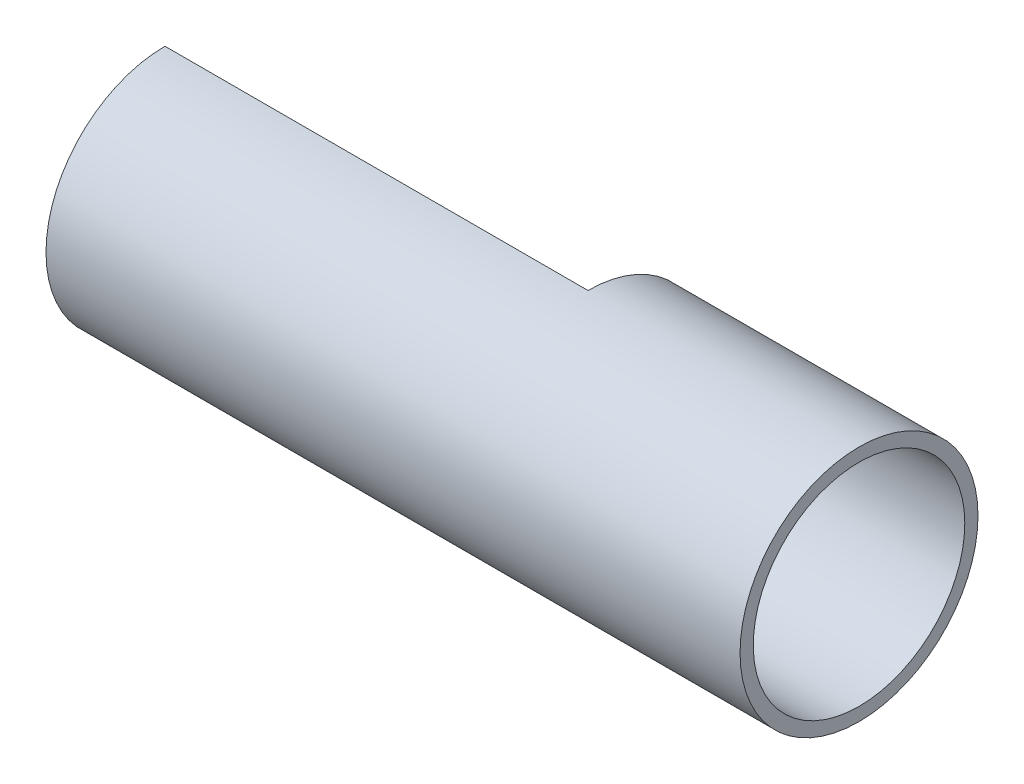
ISO-10303-21;
HEADER;
FILE_DESCRIPTION(('STEP AP214'),'2;1');
FILE_NAME('part.step','',(''),(''),'','','');
FILE_SCHEMA(('AUTOMOTIVE_DESIGN { 1 0 10303 214 1 1 1 1 }'));
ENDSEC;
DATA;
#1=APPLICATION_CONTEXT('core data for automotive mechanical design processes');
#2=APPLICATION_PROTOCOL_DEFINITION('international standard','automotive_design',2000,#1);
#3=PRODUCT_CONTEXT('',#1,'mechanical');
#4=PRODUCT('Part','Part','',(#3));
#5=PRODUCT_RELATED_PRODUCT_CATEGORY('part','',(#4));
#6=PRODUCT_DEFINITION_FORMATION('','',#4);
#7=PRODUCT_DEFINITION_CONTEXT('part definition',#1,'design');
#8=PRODUCT_DEFINITION('design','',#6,#7);
#9=PRODUCT_DEFINITION_SHAPE('','',#8);
#10=(LENGTH_UNIT() NAMED_UNIT(*) SI_UNIT(.MILLI.,.METRE.));
#11=(NAMED_UNIT(*) PLANE_ANGLE_UNIT() SI_UNIT($,.RADIAN.));
#12=(NAMED_UNIT(*) SI_UNIT($,.STERADIAN.) SOLID_ANGLE_UNIT());
#13=UNCERTAINTY_MEASURE_WITH_UNIT(LENGTH_MEASURE(1.E-05),#10,'distance_accuracy_value','');
#14=(GEOMETRIC_REPRESENTATION_CONTEXT(3) GLOBAL_UNCERTAINTY_ASSIGNED_CONTEXT((#13)) GLOBAL_UNIT_ASSIGNED_CONTEXT((#10,
#11,#12)) REPRESENTATION_CONTEXT('',''));
#15=CARTESIAN_POINT('',(0.,0.,0.));
#16=DIRECTION('',(0.,0.,1.));
#17=DIRECTION('',(1.,0.,0.));
#18=AXIS2_PLACEMENT_3D('',#15,#16,#17);
#19=CARTESIAN_POINT('',(9.3345,0.,0.));
#20=DIRECTION('',(-1.,0.,0.));
#21=DIRECTION('',(0.,0.,1.));
#22=AXIS2_PLACEMENT_3D('',#19,#20,#21);
#23=PLANE('',#22);
#24=CARTESIAN_POINT('',(9.3345,0.,0.));
#25=DIRECTION('',(-1.,0.,0.));
#26=DIRECTION('',(0.,0.,1.));
#27=AXIS2_PLACEMENT_3D('',#24,#25,#26);
#28=CIRCLE('',#27,1.27);
#29=CARTESIAN_POINT('',(9.3345,0.,1.27));
#30=VERTEX_POINT('',#29);
#31=EDGE_CURVE('E259',#30,#30,#28,.T.);
#32=ORIENTED_EDGE('',*,*,#31,.F.);
#33=EDGE_LOOP('',(#32));
#34=FACE_BOUND('',#33,.T.);
#35=DIRECTION('',(0.,0.989743318610787,0.142857142857142));
#36=VECTOR('',#35,1.);
#37=CARTESIAN_POINT('',(9.3345,8.7988181024499,1.27));
#38=LINE('',#37,#36);
#39=CARTESIAN_POINT('',(9.3345,8.7988181024499,1.27));
#40=VERTEX_POINT('',#39);
#41=CARTESIAN_POINT('',(9.3345,10.0557921170856,1.45142857142857));
#42=VERTEX_POINT('',#41);
#43=EDGE_CURVE('E184',#40,#42,#38,.T.);
#44=ORIENTED_EDGE('',*,*,#43,.T.);
#45=CARTESIAN_POINT('',(9.3345,0.,0.));
#46=DIRECTION('',(-1.,0.,0.));
#47=DIRECTION('',(0.,0.,1.));
#48=AXIS2_PLACEMENT_3D('',#45,#46,#47);
#49=CIRCLE('',#48,10.16);
#50=CARTESIAN_POINT('',(9.3345,10.0557921170856,-1.45142857142857));
#51=VERTEX_POINT('',#50);
#52=EDGE_CURVE('E240',#42,#51,#49,.T.);
#53=ORIENTED_EDGE('',*,*,#52,.T.);
#54=DIRECTION('',(0.,-0.989743318610787,0.142857142857144));
#55=VECTOR('',#54,1.);
#56=CARTESIAN_POINT('',(9.3345,8.7988181024499,-1.27));
#57=LINE('',#56,#55);
#58=CARTESIAN_POINT('',(9.3345,8.7988181024499,-1.27));
#59=VERTEX_POINT('',#58);
#60=EDGE_CURVE('E224',#51,#59,#57,.T.);
#61=ORIENTED_EDGE('',*,*,#60,.T.);
#62=CARTESIAN_POINT('',(9.3345,0.,0.));
#63=DIRECTION('',(-1.,0.,0.));
#64=DIRECTION('',(0.,0.,1.));
#65=AXIS2_PLACEMENT_3D('',#62,#63,#64);
#66=CIRCLE('',#65,8.89);
#67=CARTESIAN_POINT('',(9.3345,-8.7988181024499,-1.27));
#68=VERTEX_POINT('',#67);
#69=EDGE_CURVE('E220',#59,#68,#66,.T.);
#70=ORIENTED_EDGE('',*,*,#69,.T.);
#71=DIRECTION('',(0.,-0.989743318610788,-0.14285714285714));
#72=VECTOR('',#71,1.);
#73=CARTESIAN_POINT('',(9.3345,-8.7988181024499,-1.27));
#74=LINE('',#73,#72);
#75=CARTESIAN_POINT('',(9.3345,-10.0557921170856,-1.45142857142857));
#76=VERTEX_POINT('',#75);
#77=EDGE_CURVE('E212',#68,#76,#74,.T.);
#78=ORIENTED_EDGE('',*,*,#77,.T.);
#79=CARTESIAN_POINT('',(9.3345,-10.0557921170856,1.45142857142857));
#80=VERTEX_POINT('',#79);
#81=EDGE_CURVE('E244',#76,#80,#49,.T.);
#82=ORIENTED_EDGE('',*,*,#81,.T.);
#83=DIRECTION('',(0.,0.989743318610787,-0.142857142857143));
#84=VECTOR('',#83,1.);
#85=CARTESIAN_POINT('',(9.3345,-10.0557921170856,1.45142857142857));
#86=LINE('',#85,#84);
#87=CARTESIAN_POINT('',(9.3345,-8.7988181024499,1.27));
#88=VERTEX_POINT('',#87);
#89=EDGE_CURVE('E199',#80,#88,#86,.T.);
#90=ORIENTED_EDGE('',*,*,#89,.T.);
#91=CARTESIAN_POINT('',(9.3345,0.,0.));
#92=DIRECTION('',(-1.,0.,0.));
#93=DIRECTION('',(0.,0.,1.));
#94=AXIS2_PLACEMENT_3D('',#91,#92,#93);
#95=CIRCLE('',#94,8.89);
#96=EDGE_CURVE('E194',#88,#40,#95,.T.);
#97=ORIENTED_EDGE('',*,*,#96,.T.);
#98=EDGE_LOOP('',(#44,#53,#61,#70,#78,#82,#90,#97));
#99=FACE_BOUND('',#98,.T.);
#100=ADVANCED_FACE('F39',(#34,#99),#23,.T.);
#101=CARTESIAN_POINT('',(10.6045,0.,0.));
#102=DIRECTION('',(-1.,0.,0.));
#103=DIRECTION('',(0.,0.,1.));
#104=AXIS2_PLACEMENT_3D('',#101,#102,#103);
#105=PLANE('',#104);
#106=CARTESIAN_POINT('',(10.6045,0.,0.));
#107=DIRECTION('',(-1.,0.,0.));
#108=DIRECTION('',(0.,0.,1.));
#109=AXIS2_PLACEMENT_3D('',#106,#107,#108);
#110=CIRCLE('',#109,1.27);
#111=CARTESIAN_POINT('',(10.6045,0.,1.27));
#112=VERTEX_POINT('',#111);
#113=EDGE_CURVE('E239',#112,#112,#110,.T.);
#114=ORIENTED_EDGE('',*,*,#113,.T.);
#115=EDGE_LOOP('',(#114));
#116=FACE_BOUND('',#115,.T.);
#117=CARTESIAN_POINT('',(10.6045,0.,0.));
#118=DIRECTION('',(-1.,0.,0.));
#119=DIRECTION('',(0.,0.,1.));
#120=AXIS2_PLACEMENT_3D('',#117,#118,#119);
#121=CIRCLE('',#120,10.16);
#122=CARTESIAN_POINT('',(10.6045,10.0557921170856,-1.45142857142857));
#123=VERTEX_POINT('',#122);
#124=CARTESIAN_POINT('',(10.6045,10.0557921170856,1.45142857142857));
#125=VERTEX_POINT('',#124);
#126=EDGE_CURVE('E235',#123,#125,#121,.F.);
#127=ORIENTED_EDGE('',*,*,#126,.T.);
#128=DIRECTION('',(0.,0.989743318610787,0.142857142857142));
#129=VECTOR('',#128,1.);
#130=CARTESIAN_POINT('',(10.6045,8.7988181024499,1.27));
#131=LINE('',#130,#129);
#132=CARTESIAN_POINT('',(10.6045,8.7988181024499,1.27));
#133=VERTEX_POINT('',#132);
#134=EDGE_CURVE('E185',#133,#125,#131,.T.);
#135=ORIENTED_EDGE('',*,*,#134,.F.);
#136=CARTESIAN_POINT('',(10.6045,0.,0.));
#137=DIRECTION('',(-1.,0.,0.));
#138=DIRECTION('',(0.,0.,-1.));
#139=AXIS2_PLACEMENT_3D('',#136,#137,#138);
#140=CIRCLE('',#139,8.89);
#141=CARTESIAN_POINT('',(10.6045,-8.7988181024499,1.27));
#142=VERTEX_POINT('',#141);
#143=EDGE_CURVE('E187',#142,#133,#140,.T.);
#144=ORIENTED_EDGE('',*,*,#143,.F.);
#145=DIRECTION('',(0.,0.989743318610787,-0.142857142857143));
#146=VECTOR('',#145,1.);
#147=CARTESIAN_POINT('',(10.6045,-10.0557921170856,1.45142857142857));
#148=LINE('',#147,#146);
#149=CARTESIAN_POINT('',(10.6045,-10.0557921170856,1.45142857142857));
#150=VERTEX_POINT('',#149);
#151=EDGE_CURVE('E181',#150,#142,#148,.T.);
#152=ORIENTED_EDGE('',*,*,#151,.F.);
#153=CARTESIAN_POINT('',(10.6045,-10.0557921170856,-1.45142857142856));
#154=VERTEX_POINT('',#153);
#155=EDGE_CURVE('E236',#150,#154,#121,.F.);
#156=ORIENTED_EDGE('',*,*,#155,.T.);
#157=DIRECTION('',(0.,-0.989743318610787,-0.14285714285714));
#158=VECTOR('',#157,1.);
#159=CARTESIAN_POINT('',(10.6045,-8.7988181024499,-1.27));
#160=LINE('',#159,#158);
#161=CARTESIAN_POINT('',(10.6045,-8.7988181024499,-1.27));
#162=VERTEX_POINT('',#161);
#163=EDGE_CURVE('E213',#162,#154,#160,.T.);
#164=ORIENTED_EDGE('',*,*,#163,.F.);
#165=CARTESIAN_POINT('',(10.6045,0.,0.));
#166=DIRECTION('',(-1.,0.,0.));
#167=DIRECTION('',(0.,0.,1.));
#168=AXIS2_PLACEMENT_3D('',#165,#166,#167);
#169=CIRCLE('',#168,8.89);
#170=CARTESIAN_POINT('',(10.6045,8.7988181024499,-1.27));
#171=VERTEX_POINT('',#170);
#172=EDGE_CURVE('E180',#171,#162,#169,.T.);
#173=ORIENTED_EDGE('',*,*,#172,.F.);
#174=DIRECTION('',(0.,-0.989743318610787,0.142857142857144));
#175=VECTOR('',#174,1.);
#176=CARTESIAN_POINT('',(10.6045,8.7988181024499,-1.27));
#177=LINE('',#176,#175);
#178=EDGE_CURVE('E209',#123,#171,#177,.T.);
#179=ORIENTED_EDGE('',*,*,#178,.F.);
#180=EDGE_LOOP('',(#127,#135,#144,#152,#156,#164,#173,#179));
#181=FACE_BOUND('',#180,.T.);
#182=ADVANCED_FACE('F309',(#116,#181),#105,.F.);
#183=CARTESIAN_POINT('',(-39.6875,0.,0.));
#184=DIRECTION('',(1.,0.,0.));
#185=DIRECTION('',(0.,0.,-1.));
#186=AXIS2_PLACEMENT_3D('',#183,#184,#185);
#187=CYLINDRICAL_SURFACE('',#186,1.27);
#188=ORIENTED_EDGE('',*,*,#113,.F.);
#189=EDGE_LOOP('',(#188));
#190=FACE_BOUND('',#189,.T.);
#191=ORIENTED_EDGE('',*,*,#31,.T.);
#192=EDGE_LOOP('',(#191));
#193=FACE_BOUND('',#192,.T.);
#194=ADVANCED_FACE('F295',(#190,#193),#187,.F.);
#195=CARTESIAN_POINT('',(-33.3375,0.,0.));
#196=DIRECTION('',(1.,0.,0.));
#197=DIRECTION('',(0.,1.,0.));
#198=AXIS2_PLACEMENT_3D('',#195,#196,#197);
#199=SPHERICAL_SURFACE('',#198,6.35);
#200=CARTESIAN_POINT('',(-33.3375,0.,0.));
#201=DIRECTION('',(1.,0.,0.));
#202=DIRECTION('',(0.,0.,-1.));
#203=AXIS2_PLACEMENT_3D('',#200,#201,#202);
#204=CIRCLE('',#203,6.35);
#205=CARTESIAN_POINT('',(-33.3375,6.35,0.));
#206=VERTEX_POINT('',#205);
#207=CARTESIAN_POINT('',(-33.3375,-6.35,0.));
#208=VERTEX_POINT('',#207);
#209=EDGE_CURVE('E248',#206,#208,#204,.T.);
#210=ORIENTED_EDGE('',*,*,#209,.F.);
#211=CARTESIAN_POINT('',(-33.3375,0.,0.));
#212=DIRECTION('',(-1.,0.,0.));
#213=DIRECTION('',(0.,0.,1.));
#214=AXIS2_PLACEMENT_3D('',#211,#212,#213);
#215=CIRCLE('',#214,6.35);
#216=EDGE_CURVE('E155',#208,#206,#215,.F.);
#217=ORIENTED_EDGE('',*,*,#216,.F.);
#218=EDGE_LOOP('',(#210,#217));
#219=FACE_BOUND('',#218,.T.);
#220=CARTESIAN_POINT('',(-39.5592039466693,0.,0.));
#221=DIRECTION('',(1.,0.,0.));
#222=DIRECTION('',(0.,0.,-1.));
#223=AXIS2_PLACEMENT_3D('',#220,#221,#222);
#224=CIRCLE('',#223,1.27);
#225=CARTESIAN_POINT('',(-39.5592039466693,0.,-1.27));
#226=VERTEX_POINT('',#225);
#227=EDGE_CURVE('E251',#226,#226,#224,.T.);
#228=ORIENTED_EDGE('',*,*,#227,.T.);
#229=EDGE_LOOP('',(#228));
#230=FACE_BOUND('',#229,.T.);
#231=ADVANCED_FACE('F292',(#219,#230),#199,.T.);
#232=CARTESIAN_POINT('',(33.3375,0.,0.));
#233=DIRECTION('',(-1.,0.,0.));
#234=DIRECTION('',(0.,0.,1.));
#235=AXIS2_PLACEMENT_3D('',#232,#233,#234);
#236=CYLINDRICAL_SURFACE('',#235,11.43);
#237=CARTESIAN_POINT('',(33.3375,0.,0.));
#238=DIRECTION('',(1.,0.,0.));
#239=DIRECTION('',(0.,0.,-1.));
#240=AXIS2_PLACEMENT_3D('',#237,#238,#239);
#241=CIRCLE('',#240,11.43);
#242=CARTESIAN_POINT('',(33.3375,0.,-11.43));
#243=VERTEX_POINT('',#242);
#244=EDGE_CURVE('E252',#243,#243,#241,.T.);
#245=ORIENTED_EDGE('',*,*,#244,.F.);
#246=EDGE_LOOP('',(#245));
#247=FACE_BOUND('',#246,.T.);
#248=CARTESIAN_POINT('',(7.3025,0.,0.));
#249=DIRECTION('',(1.,0.,0.));
#250=DIRECTION('',(0.,0.,-1.));
#251=AXIS2_PLACEMENT_3D('',#248,#249,#250);
#252=CIRCLE('',#251,11.43);
#253=CARTESIAN_POINT('',(7.3025,-11.43,0.));
#254=VERTEX_POINT('',#253);
#255=CARTESIAN_POINT('',(7.3025,11.43,0.));
#256=VERTEX_POINT('',#255);
#257=EDGE_CURVE('E147',#254,#256,#252,.T.);
#258=ORIENTED_EDGE('',*,*,#257,.T.);
#259=DIRECTION('',(-1.,0.,0.));
#260=VECTOR('',#259,1.);
#261=CARTESIAN_POINT('',(-33.3375,11.43,0.));
#262=LINE('',#261,#260);
#263=CARTESIAN_POINT('',(-33.3375,11.43,0.));
#264=VERTEX_POINT('',#263);
#265=EDGE_CURVE('E161',#256,#264,#262,.T.);
#266=ORIENTED_EDGE('',*,*,#265,.T.);
#267=CARTESIAN_POINT('',(-33.3375,0.,0.));
#268=DIRECTION('',(1.,0.,0.));
#269=DIRECTION('',(0.,0.,-1.));
#270=AXIS2_PLACEMENT_3D('',#267,#268,#269);
#271=CIRCLE('',#270,11.43);
#272=CARTESIAN_POINT('',(-33.3375,-11.43,0.));
#273=VERTEX_POINT('',#272);
#274=EDGE_CURVE('E165',#264,#273,#271,.T.);
#275=ORIENTED_EDGE('',*,*,#274,.T.);
#276=DIRECTION('',(1.,0.,0.));
#277=VECTOR('',#276,1.);
#278=CARTESIAN_POINT('',(-33.3375,-11.43,0.));
#279=LINE('',#278,#277);
#280=EDGE_CURVE('E54',#273,#254,#279,.T.);
#281=ORIENTED_EDGE('',*,*,#280,.T.);
#282=EDGE_LOOP('',(#258,#266,#275,#281));
#283=FACE_BOUND('',#282,.T.);
#284=ADVANCED_FACE('F41',(#247,#283),#236,.T.);
#285=CARTESIAN_POINT('',(33.3375,0.,0.));
#286=DIRECTION('',(1.,0.,0.));
#287=DIRECTION('',(0.,0.,-1.));
#288=AXIS2_PLACEMENT_3D('',#285,#286,#287);
#289=PLANE('',#288);
#290=CARTESIAN_POINT('',(33.3375,0.,0.));
#291=DIRECTION('',(1.,0.,0.));
#292=DIRECTION('',(0.,0.,-1.));
#293=AXIS2_PLACEMENT_3D('',#290,#291,#292);
#294=CIRCLE('',#293,10.16);
#295=CARTESIAN_POINT('',(33.3375,0.,-10.16));
#296=VERTEX_POINT('',#295);
#297=EDGE_CURVE('E208',#296,#296,#294,.T.);
#298=ORIENTED_EDGE('',*,*,#297,.F.);
#299=EDGE_LOOP('',(#298));
#300=FACE_BOUND('',#299,.T.);
#301=ORIENTED_EDGE('',*,*,#244,.T.);
#302=EDGE_LOOP('',(#301));
#303=FACE_BOUND('',#302,.T.);
#304=ADVANCED_FACE('F307',(#300,#303),#289,.T.);
#305=CARTESIAN_POINT('',(-33.3375,0.,0.));
#306=DIRECTION('',(1.,0.,0.));
#307=DIRECTION('',(0.,0.,-1.));
#308=AXIS2_PLACEMENT_3D('',#305,#306,#307);
#309=PLANE('',#308);
#310=ORIENTED_EDGE('',*,*,#274,.F.);
#311=DIRECTION('',(0.,-1.,0.));
#312=VECTOR('',#311,1.);
#313=CARTESIAN_POINT('',(-33.3375,11.43,0.));
#314=LINE('',#313,#312);
#315=EDGE_CURVE('E166',#264,#206,#314,.T.);
#316=ORIENTED_EDGE('',*,*,#315,.T.);
#317=ORIENTED_EDGE('',*,*,#209,.T.);
#318=EDGE_CURVE('E171',#208,#273,#314,.T.);
#319=ORIENTED_EDGE('',*,*,#318,.T.);
#320=EDGE_LOOP('',(#310,#316,#317,#319));
#321=FACE_BOUND('',#320,.T.);
#322=ADVANCED_FACE('F289',(#321),#309,.F.);
#323=DIRECTION('',(1.,0.,0.));
#324=VECTOR('',#323,1.);
#325=CARTESIAN_POINT('',(-39.6875,-1.27,0.));
#326=LINE('',#325,#324);
#327=CARTESIAN_POINT('',(-33.3375,-1.27,0.));
#328=VERTEX_POINT('',#327);
#329=CARTESIAN_POINT('',(-30.7975,-1.27,0.));
#330=VERTEX_POINT('',#329);
#331=EDGE_CURVE('E156',#328,#330,#326,.T.);
#332=ORIENTED_EDGE('',*,*,#331,.F.);
#333=CARTESIAN_POINT('',(-33.3375,0.,0.));
#334=DIRECTION('',(-1.,0.,0.));
#335=DIRECTION('',(0.,0.,1.));
#336=AXIS2_PLACEMENT_3D('',#333,#334,#335);
#337=CIRCLE('',#336,1.27);
#338=CARTESIAN_POINT('',(-33.3375,1.27,0.));
#339=VERTEX_POINT('',#338);
#340=EDGE_CURVE('E12',#339,#328,#337,.T.);
#341=ORIENTED_EDGE('',*,*,#340,.F.);
#342=DIRECTION('',(1.,0.,0.));
#343=VECTOR('',#342,1.);
#344=CARTESIAN_POINT('',(-39.6875,1.27,0.));
#345=LINE('',#344,#343);
#346=CARTESIAN_POINT('',(-30.7975,1.27,0.));
#347=VERTEX_POINT('',#346);
#348=EDGE_CURVE('E175',#347,#339,#345,.F.);
#349=ORIENTED_EDGE('',*,*,#348,.F.);
#350=CARTESIAN_POINT('',(-30.7975,0.,0.));
#351=DIRECTION('',(-1.,0.,0.));
#352=DIRECTION('',(0.,0.,1.));
#353=AXIS2_PLACEMENT_3D('',#350,#351,#352);
#354=CIRCLE('',#353,1.27);
#355=EDGE_CURVE('E243',#330,#347,#354,.T.);
#356=ORIENTED_EDGE('',*,*,#355,.F.);
#357=EDGE_LOOP('',(#332,#341,#349,#356));
#358=FACE_BOUND('',#357,.T.);
#359=ORIENTED_EDGE('',*,*,#227,.F.);
#360=EDGE_LOOP('',(#359));
#361=FACE_BOUND('',#360,.T.);
#362=ADVANCED_FACE('F276',(#358,#361),#187,.F.);
#363=CARTESIAN_POINT('',(9.3345,0.,0.));
#364=DIRECTION('',(-1.,0.,0.));
#365=DIRECTION('',(0.,0.,1.));
#366=AXIS2_PLACEMENT_3D('',#363,#364,#365);
#367=CYLINDRICAL_SURFACE('',#366,10.16);
#368=DIRECTION('',(1.,0.,0.));
#369=VECTOR('',#368,1.);
#370=CARTESIAN_POINT('',(-12.654313528887,-10.0557921170856,1.45142857142857));
#371=LINE('',#370,#369);
#372=EDGE_CURVE('E202',#80,#150,#371,.T.);
#373=ORIENTED_EDGE('',*,*,#372,.F.);
#374=ORIENTED_EDGE('',*,*,#81,.F.);
#375=DIRECTION('',(1.,0.,0.));
#376=VECTOR('',#375,1.);
#377=CARTESIAN_POINT('',(-12.654313528887,-10.0557921170856,-1.45142857142857));
#378=LINE('',#377,#376);
#379=EDGE_CURVE('E219',#76,#154,#378,.T.);
#380=ORIENTED_EDGE('',*,*,#379,.T.);
#381=ORIENTED_EDGE('',*,*,#155,.F.);
#382=EDGE_LOOP('',(#373,#374,#380,#381));
#383=FACE_BOUND('',#382,.T.);
#384=ORIENTED_EDGE('',*,*,#52,.F.);
#385=DIRECTION('',(1.,0.,0.));
#386=VECTOR('',#385,1.);
#387=CARTESIAN_POINT('',(-12.654313528887,10.0557921170856,1.45142857142857));
#388=LINE('',#387,#386);
#389=EDGE_CURVE('E193',#42,#125,#388,.T.);
#390=ORIENTED_EDGE('',*,*,#389,.T.);
#391=ORIENTED_EDGE('',*,*,#126,.F.);
#392=DIRECTION('',(1.,0.,0.));
#393=VECTOR('',#392,1.);
#394=CARTESIAN_POINT('',(-12.654313528887,10.0557921170856,-1.45142857142857));
#395=LINE('',#394,#393);
#396=EDGE_CURVE('E227',#51,#123,#395,.T.);
#397=ORIENTED_EDGE('',*,*,#396,.F.);
#398=EDGE_LOOP('',(#384,#390,#391,#397));
#399=FACE_BOUND('',#398,.T.);
#400=CARTESIAN_POINT('',(-30.7975,0.,0.));
#401=DIRECTION('',(-1.,0.,0.));
#402=DIRECTION('',(0.,0.,1.));
#403=AXIS2_PLACEMENT_3D('',#400,#401,#402);
#404=CIRCLE('',#403,10.16);
#405=CARTESIAN_POINT('',(-30.7975,-10.16,0.));
#406=VERTEX_POINT('',#405);
#407=CARTESIAN_POINT('',(-30.7975,10.16,0.));
#408=VERTEX_POINT('',#407);
#409=EDGE_CURVE('E245',#406,#408,#404,.T.);
#410=ORIENTED_EDGE('',*,*,#409,.T.);
#411=DIRECTION('',(-1.,0.,0.));
#412=VECTOR('',#411,1.);
#413=CARTESIAN_POINT('',(9.3345,10.16,0.));
#414=LINE('',#413,#412);
#415=CARTESIAN_POINT('',(7.3025,10.16,0.));
#416=VERTEX_POINT('',#415);
#417=EDGE_CURVE('E62',#408,#416,#414,.F.);
#418=ORIENTED_EDGE('',*,*,#417,.T.);
#419=CARTESIAN_POINT('',(7.3025,0.,0.));
#420=DIRECTION('',(1.,0.,0.));
#421=DIRECTION('',(0.,0.,-1.));
#422=AXIS2_PLACEMENT_3D('',#419,#420,#421);
#423=CIRCLE('',#422,10.16);
#424=CARTESIAN_POINT('',(7.3025,-10.16,0.));
#425=VERTEX_POINT('',#424);
#426=EDGE_CURVE('E47',#416,#425,#423,.F.);
#427=ORIENTED_EDGE('',*,*,#426,.T.);
#428=DIRECTION('',(-1.,0.,0.));
#429=VECTOR('',#428,1.);
#430=CARTESIAN_POINT('',(9.3345,-10.16,0.));
#431=LINE('',#430,#429);
#432=EDGE_CURVE('E160',#425,#406,#431,.T.);
#433=ORIENTED_EDGE('',*,*,#432,.T.);
#434=EDGE_LOOP('',(#410,#418,#427,#433));
#435=FACE_BOUND('',#434,.T.);
#436=ORIENTED_EDGE('',*,*,#297,.T.);
#437=EDGE_LOOP('',(#436));
#438=FACE_BOUND('',#437,.T.);
#439=ADVANCED_FACE('F299',(#383,#399,#435,#438),#367,.F.);
#440=CARTESIAN_POINT('',(-30.7975,0.,0.));
#441=DIRECTION('',(-1.,0.,0.));
#442=DIRECTION('',(0.,0.,1.));
#443=AXIS2_PLACEMENT_3D('',#440,#441,#442);
#444=PLANE('',#443);
#445=ORIENTED_EDGE('',*,*,#409,.F.);
#446=DIRECTION('',(0.,1.,0.));
#447=VECTOR('',#446,1.);
#448=CARTESIAN_POINT('',(-30.7975,0.,0.));
#449=LINE('',#448,#447);
#450=EDGE_CURVE('E266',#406,#330,#449,.T.);
#451=ORIENTED_EDGE('',*,*,#450,.T.);
#452=ORIENTED_EDGE('',*,*,#355,.T.);
#453=EDGE_CURVE('E255',#347,#408,#449,.T.);
#454=ORIENTED_EDGE('',*,*,#453,.T.);
#455=EDGE_LOOP('',(#445,#451,#452,#454));
#456=FACE_BOUND('',#455,.T.);
#457=ADVANCED_FACE('F272',(#456),#444,.F.);
#458=CARTESIAN_POINT('',(-12.654313528887,-8.7988181024499,-1.27));
#459=DIRECTION('',(0.,-0.14285714285714,0.989743318610788));
#460=DIRECTION('',(0.,-0.989743318610788,-0.14285714285714));
#461=AXIS2_PLACEMENT_3D('',#458,#459,#460);
#462=PLANE('',#461);
#463=DIRECTION('',(1.,0.,0.));
#464=VECTOR('',#463,1.);
#465=CARTESIAN_POINT('',(-12.654313528887,-8.7988181024499,-1.27));
#466=LINE('',#465,#464);
#467=EDGE_CURVE('E190',#68,#162,#466,.T.);
#468=ORIENTED_EDGE('',*,*,#467,.T.);
#469=ORIENTED_EDGE('',*,*,#163,.T.);
#470=ORIENTED_EDGE('',*,*,#379,.F.);
#471=ORIENTED_EDGE('',*,*,#77,.F.);
#472=EDGE_LOOP('',(#468,#469,#470,#471));
#473=FACE_BOUND('',#472,.T.);
#474=ADVANCED_FACE('F324',(#473),#462,.F.);
#475=CARTESIAN_POINT('',(-12.654313528887,8.7988181024499,-1.27));
#476=DIRECTION('',(0.,0.142857142857144,0.989743318610787));
#477=DIRECTION('',(0.,-0.989743318610787,0.142857142857144));
#478=AXIS2_PLACEMENT_3D('',#475,#476,#477);
#479=PLANE('',#478);
#480=ORIENTED_EDGE('',*,*,#396,.T.);
#481=ORIENTED_EDGE('',*,*,#178,.T.);
#482=DIRECTION('',(1.,0.,0.));
#483=VECTOR('',#482,1.);
#484=CARTESIAN_POINT('',(-12.654313528887,8.7988181024499,-1.27));
#485=LINE('',#484,#483);
#486=EDGE_CURVE('E223',#59,#171,#485,.T.);
#487=ORIENTED_EDGE('',*,*,#486,.F.);
#488=ORIENTED_EDGE('',*,*,#60,.F.);
#489=EDGE_LOOP('',(#480,#481,#487,#488));
#490=FACE_BOUND('',#489,.T.);
#491=ADVANCED_FACE('F328',(#490),#479,.F.);
#492=CARTESIAN_POINT('',(-12.654313528887,0.,0.));
#493=DIRECTION('',(1.,0.,0.));
#494=DIRECTION('',(0.,0.,-1.));
#495=AXIS2_PLACEMENT_3D('',#492,#493,#494);
#496=CYLINDRICAL_SURFACE('',#495,8.89);
#497=ORIENTED_EDGE('',*,*,#486,.T.);
#498=ORIENTED_EDGE('',*,*,#172,.T.);
#499=ORIENTED_EDGE('',*,*,#467,.F.);
#500=ORIENTED_EDGE('',*,*,#69,.F.);
#501=EDGE_LOOP('',(#497,#498,#499,#500));
#502=FACE_BOUND('',#501,.T.);
#503=ADVANCED_FACE('F333',(#502),#496,.T.);
#504=CARTESIAN_POINT('',(-12.654313528887,8.7988181024499,1.27));
#505=DIRECTION('',(0.,0.142857142857142,-0.989743318610787));
#506=DIRECTION('',(0.,0.989743318610787,0.142857142857142));
#507=AXIS2_PLACEMENT_3D('',#504,#505,#506);
#508=PLANE('',#507);
#509=DIRECTION('',(1.,0.,0.));
#510=VECTOR('',#509,1.);
#511=CARTESIAN_POINT('',(-12.654313528887,8.7988181024499,1.27));
#512=LINE('',#511,#510);
#513=EDGE_CURVE('E197',#40,#133,#512,.T.);
#514=ORIENTED_EDGE('',*,*,#513,.T.);
#515=ORIENTED_EDGE('',*,*,#134,.T.);
#516=ORIENTED_EDGE('',*,*,#389,.F.);
#517=ORIENTED_EDGE('',*,*,#43,.F.);
#518=EDGE_LOOP('',(#514,#515,#516,#517));
#519=FACE_BOUND('',#518,.T.);
#520=ADVANCED_FACE('F339',(#519),#508,.F.);
#521=CARTESIAN_POINT('',(-12.654313528887,-10.0557921170856,1.45142857142857));
#522=DIRECTION('',(0.,-0.142857142857143,-0.989743318610787));
#523=DIRECTION('',(0.,0.989743318610787,-0.142857142857143));
#524=AXIS2_PLACEMENT_3D('',#521,#522,#523);
#525=PLANE('',#524);
#526=ORIENTED_EDGE('',*,*,#372,.T.);
#527=ORIENTED_EDGE('',*,*,#151,.T.);
#528=DIRECTION('',(1.,0.,0.));
#529=VECTOR('',#528,1.);
#530=CARTESIAN_POINT('',(-12.654313528887,-8.7988181024499,1.27));
#531=LINE('',#530,#529);
#532=EDGE_CURVE('E198',#88,#142,#531,.T.);
#533=ORIENTED_EDGE('',*,*,#532,.F.);
#534=ORIENTED_EDGE('',*,*,#89,.F.);
#535=EDGE_LOOP('',(#526,#527,#533,#534));
#536=FACE_BOUND('',#535,.T.);
#537=ADVANCED_FACE('F343',(#536),#525,.F.);
#538=CARTESIAN_POINT('',(-12.654313528887,0.,0.));
#539=DIRECTION('',(1.,0.,0.));
#540=DIRECTION('',(0.,0.,-1.));
#541=AXIS2_PLACEMENT_3D('',#538,#539,#540);
#542=CYLINDRICAL_SURFACE('',#541,8.89);
#543=ORIENTED_EDGE('',*,*,#532,.T.);
#544=ORIENTED_EDGE('',*,*,#143,.T.);
#545=ORIENTED_EDGE('',*,*,#513,.F.);
#546=ORIENTED_EDGE('',*,*,#96,.F.);
#547=EDGE_LOOP('',(#543,#544,#545,#546));
#548=FACE_BOUND('',#547,.T.);
#549=ADVANCED_FACE('F347',(#548),#542,.T.);
#550=CARTESIAN_POINT('',(-33.3375,11.43,-11.43));
#551=DIRECTION('',(-1.,0.,0.));
#552=DIRECTION('',(0.,0.,1.));
#553=AXIS2_PLACEMENT_3D('',#550,#551,#552);
#554=PLANE('',#553);
#555=ORIENTED_EDGE('',*,*,#216,.T.);
#556=EDGE_CURVE('E169',#206,#339,#314,.T.);
#557=ORIENTED_EDGE('',*,*,#556,.T.);
#558=ORIENTED_EDGE('',*,*,#340,.T.);
#559=EDGE_CURVE('E287',#328,#208,#314,.T.);
#560=ORIENTED_EDGE('',*,*,#559,.T.);
#561=EDGE_LOOP('',(#555,#557,#558,#560));
#562=FACE_BOUND('',#561,.T.);
#563=ADVANCED_FACE('F283',(#562),#554,.F.);
#564=CARTESIAN_POINT('',(7.3025,11.43,-11.43));
#565=DIRECTION('',(1.,0.,0.));
#566=DIRECTION('',(0.,0.,-1.));
#567=AXIS2_PLACEMENT_3D('',#564,#565,#566);
#568=PLANE('',#567);
#569=ORIENTED_EDGE('',*,*,#257,.F.);
#570=DIRECTION('',(0.,1.,0.));
#571=VECTOR('',#570,1.);
#572=CARTESIAN_POINT('',(7.3025,11.43,0.));
#573=LINE('',#572,#571);
#574=EDGE_CURVE('E149',#254,#425,#573,.T.);
#575=ORIENTED_EDGE('',*,*,#574,.T.);
#576=ORIENTED_EDGE('',*,*,#426,.F.);
#577=EDGE_CURVE('E151',#416,#256,#573,.T.);
#578=ORIENTED_EDGE('',*,*,#577,.T.);
#579=EDGE_LOOP('',(#569,#575,#576,#578));
#580=FACE_BOUND('',#579,.T.);
#581=ADVANCED_FACE('F148',(#580),#568,.F.);
#582=CARTESIAN_POINT('',(0.,0.,0.));
#583=DIRECTION('',(0.,0.,1.));
#584=DIRECTION('',(1.,0.,0.));
#585=AXIS2_PLACEMENT_3D('',#582,#583,#584);
#586=PLANE('',#585);
#587=ORIENTED_EDGE('',*,*,#331,.T.);
#588=ORIENTED_EDGE('',*,*,#450,.F.);
#589=ORIENTED_EDGE('',*,*,#432,.F.);
#590=ORIENTED_EDGE('',*,*,#574,.F.);
#591=ORIENTED_EDGE('',*,*,#280,.F.);
#592=ORIENTED_EDGE('',*,*,#318,.F.);
#593=ORIENTED_EDGE('',*,*,#559,.F.);
#594=EDGE_LOOP('',(#587,#588,#589,#590,#591,#592,#593));
#595=FACE_BOUND('',#594,.T.);
#596=ADVANCED_FACE('F158',(#595),#586,.F.);
#597=ORIENTED_EDGE('',*,*,#348,.T.);
#598=ORIENTED_EDGE('',*,*,#556,.F.);
#599=ORIENTED_EDGE('',*,*,#315,.F.);
#600=ORIENTED_EDGE('',*,*,#265,.F.);
#601=ORIENTED_EDGE('',*,*,#577,.F.);
#602=ORIENTED_EDGE('',*,*,#417,.F.);
#603=ORIENTED_EDGE('',*,*,#453,.F.);
#604=EDGE_LOOP('',(#597,#598,#599,#600,#601,#602,#603));
#605=FACE_BOUND('',#604,.T.);
#606=ADVANCED_FACE('F281',(#605),#586,.F.);
#607=CLOSED_SHELL('',(#100,#182,#194,#231,#284,#304,#322,#362,#439,#457,#474,#491,#503,#520,
#537,#549,#563,#581,#596,#606));
#608=MANIFOLD_SOLID_BREP('B2',#607);
#609=ADVANCED_BREP_SHAPE_REPRESENTATION('',(#18,#608),#14);
#610=SHAPE_DEFINITION_REPRESENTATION(#9,#609);
ENDSEC;
END-ISO-10303-21;
